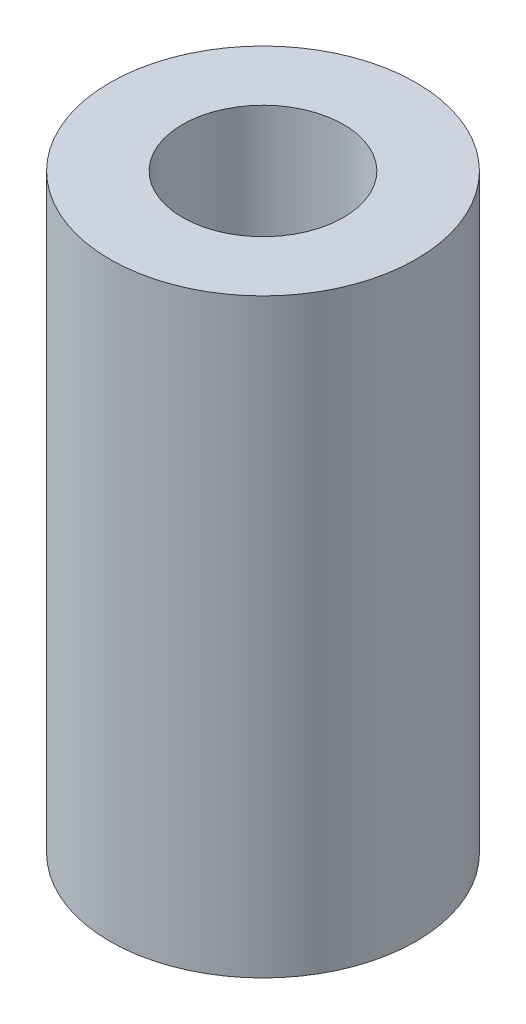
ISO-10303-21;
HEADER;
FILE_DESCRIPTION(('STEP AP214'),'2;1');
FILE_NAME('part.step','',(''),(''),'','','');
FILE_SCHEMA(('AUTOMOTIVE_DESIGN { 1 0 10303 214 1 1 1 1 }'));
ENDSEC;
DATA;
#1=APPLICATION_CONTEXT('core data for automotive mechanical design processes');
#2=APPLICATION_PROTOCOL_DEFINITION('international standard','automotive_design',2000,#1);
#3=PRODUCT_CONTEXT('',#1,'mechanical');
#4=PRODUCT('Part','Part','',(#3));
#5=PRODUCT_RELATED_PRODUCT_CATEGORY('part','',(#4));
#6=PRODUCT_DEFINITION_FORMATION('','',#4);
#7=PRODUCT_DEFINITION_CONTEXT('part definition',#1,'design');
#8=PRODUCT_DEFINITION('design','',#6,#7);
#9=PRODUCT_DEFINITION_SHAPE('','',#8);
#10=(LENGTH_UNIT() NAMED_UNIT(*) SI_UNIT(.MILLI.,.METRE.));
#11=(NAMED_UNIT(*) PLANE_ANGLE_UNIT() SI_UNIT($,.RADIAN.));
#12=(NAMED_UNIT(*) SI_UNIT($,.STERADIAN.) SOLID_ANGLE_UNIT());
#13=UNCERTAINTY_MEASURE_WITH_UNIT(LENGTH_MEASURE(1.E-05),#10,'distance_accuracy_value','');
#14=(GEOMETRIC_REPRESENTATION_CONTEXT(3) GLOBAL_UNCERTAINTY_ASSIGNED_CONTEXT((#13)) GLOBAL_UNIT_ASSIGNED_CONTEXT((#10,
#11,#12)) REPRESENTATION_CONTEXT('',''));
#15=CARTESIAN_POINT('',(0.,0.,0.));
#16=DIRECTION('',(0.,0.,1.));
#17=DIRECTION('',(1.,0.,0.));
#18=AXIS2_PLACEMENT_3D('',#15,#16,#17);
#19=CARTESIAN_POINT('',(0.,11.,0.));
#20=DIRECTION('',(0.,-1.,0.));
#21=DIRECTION('',(0.,0.,-1.));
#22=AXIS2_PLACEMENT_3D('',#19,#20,#21);
#23=CYLINDRICAL_SURFACE('',#22,1.25);
#24=CARTESIAN_POINT('',(0.,0.,0.));
#25=DIRECTION('',(0.,1.,0.));
#26=DIRECTION('',(0.,0.,1.));
#27=AXIS2_PLACEMENT_3D('',#24,#25,#26);
#28=CIRCLE('',#27,1.25);
#29=CARTESIAN_POINT('',(0.,0.,1.25));
#30=VERTEX_POINT('',#29);
#31=EDGE_CURVE('E45',#30,#30,#28,.T.);
#32=ORIENTED_EDGE('',*,*,#31,.F.);
#33=EDGE_LOOP('',(#32));
#34=FACE_BOUND('',#33,.T.);
#35=CARTESIAN_POINT('',(0.,6.,0.));
#36=DIRECTION('',(0.,1.,0.));
#37=DIRECTION('',(0.,0.,1.));
#38=AXIS2_PLACEMENT_3D('',#35,#36,#37);
#39=CIRCLE('',#38,1.25);
#40=CARTESIAN_POINT('',(0.,6.,1.25));
#41=VERTEX_POINT('',#40);
#42=EDGE_CURVE('E49',#41,#41,#39,.T.);
#43=ORIENTED_EDGE('',*,*,#42,.T.);
#44=EDGE_LOOP('',(#43));
#45=FACE_BOUND('',#44,.T.);
#46=ADVANCED_FACE('F32',(#34,#45),#23,.F.);
#47=CARTESIAN_POINT('',(0.,11.,0.));
#48=DIRECTION('',(0.,1.,0.));
#49=DIRECTION('',(0.,0.,1.));
#50=AXIS2_PLACEMENT_3D('',#47,#48,#49);
#51=PLANE('',#50);
#52=CARTESIAN_POINT('',(0.,11.,0.));
#53=DIRECTION('',(0.,1.,0.));
#54=DIRECTION('',(0.,0.,1.));
#55=AXIS2_PLACEMENT_3D('',#52,#53,#54);
#56=CIRCLE('',#55,1.5);
#57=CARTESIAN_POINT('',(0.,11.,1.5));
#58=VERTEX_POINT('',#57);
#59=EDGE_CURVE('E36',#58,#58,#56,.F.);
#60=ORIENTED_EDGE('',*,*,#59,.T.);
#61=EDGE_LOOP('',(#60));
#62=FACE_BOUND('',#61,.T.);
#63=CARTESIAN_POINT('',(0.,11.,0.));
#64=DIRECTION('',(0.,1.,0.));
#65=DIRECTION('',(0.,0.,1.));
#66=AXIS2_PLACEMENT_3D('',#63,#64,#65);
#67=CIRCLE('',#66,2.85);
#68=CARTESIAN_POINT('',(0.,11.,2.85));
#69=VERTEX_POINT('',#68);
#70=EDGE_CURVE('E10',#69,#69,#67,.T.);
#71=ORIENTED_EDGE('',*,*,#70,.T.);
#72=EDGE_LOOP('',(#71));
#73=FACE_BOUND('',#72,.T.);
#74=ADVANCED_FACE('F75',(#62,#73),#51,.T.);
#75=CARTESIAN_POINT('',(0.,0.,0.));
#76=DIRECTION('',(0.,1.,0.));
#77=DIRECTION('',(0.,0.,1.));
#78=AXIS2_PLACEMENT_3D('',#75,#76,#77);
#79=PLANE('',#78);
#80=CARTESIAN_POINT('',(0.,0.,0.));
#81=DIRECTION('',(0.,1.,0.));
#82=DIRECTION('',(0.,0.,1.));
#83=AXIS2_PLACEMENT_3D('',#80,#81,#82);
#84=CIRCLE('',#83,2.85);
#85=CARTESIAN_POINT('',(0.,0.,2.85));
#86=VERTEX_POINT('',#85);
#87=EDGE_CURVE('E40',#86,#86,#84,.T.);
#88=ORIENTED_EDGE('',*,*,#87,.F.);
#89=EDGE_LOOP('',(#88));
#90=FACE_BOUND('',#89,.T.);
#91=ORIENTED_EDGE('',*,*,#31,.T.);
#92=EDGE_LOOP('',(#91));
#93=FACE_BOUND('',#92,.T.);
#94=ADVANCED_FACE('F70',(#90,#93),#79,.F.);
#95=CARTESIAN_POINT('',(0.,11.,0.));
#96=DIRECTION('',(0.,-1.,0.));
#97=DIRECTION('',(0.,0.,-1.));
#98=AXIS2_PLACEMENT_3D('',#95,#96,#97);
#99=CYLINDRICAL_SURFACE('',#98,2.85);
#100=ORIENTED_EDGE('',*,*,#70,.F.);
#101=EDGE_LOOP('',(#100));
#102=FACE_BOUND('',#101,.T.);
#103=ORIENTED_EDGE('',*,*,#87,.T.);
#104=EDGE_LOOP('',(#103));
#105=FACE_BOUND('',#104,.T.);
#106=ADVANCED_FACE('F34',(#102,#105),#99,.T.);
#107=CARTESIAN_POINT('',(0.,12.,0.));
#108=DIRECTION('',(0.,-1.,0.));
#109=DIRECTION('',(0.,0.,-1.));
#110=AXIS2_PLACEMENT_3D('',#107,#108,#109);
#111=CYLINDRICAL_SURFACE('',#110,1.5);
#112=ORIENTED_EDGE('',*,*,#59,.F.);
#113=EDGE_LOOP('',(#112));
#114=FACE_BOUND('',#113,.T.);
#115=CARTESIAN_POINT('',(0.,6.,0.));
#116=DIRECTION('',(0.,1.,0.));
#117=DIRECTION('',(0.,0.,1.));
#118=AXIS2_PLACEMENT_3D('',#115,#116,#117);
#119=CIRCLE('',#118,1.5);
#120=CARTESIAN_POINT('',(0.,6.,1.5));
#121=VERTEX_POINT('',#120);
#122=EDGE_CURVE('E51',#121,#121,#119,.T.);
#123=ORIENTED_EDGE('',*,*,#122,.F.);
#124=EDGE_LOOP('',(#123));
#125=FACE_BOUND('',#124,.T.);
#126=ADVANCED_FACE('F60',(#114,#125),#111,.F.);
#127=CARTESIAN_POINT('',(0.,6.,0.));
#128=DIRECTION('',(0.,1.,0.));
#129=DIRECTION('',(0.,0.,1.));
#130=AXIS2_PLACEMENT_3D('',#127,#128,#129);
#131=PLANE('',#130);
#132=ORIENTED_EDGE('',*,*,#42,.F.);
#133=EDGE_LOOP('',(#132));
#134=FACE_BOUND('',#133,.T.);
#135=ORIENTED_EDGE('',*,*,#122,.T.);
#136=EDGE_LOOP('',(#135));
#137=FACE_BOUND('',#136,.T.);
#138=ADVANCED_FACE('F58',(#134,#137),#131,.T.);
#139=CLOSED_SHELL('',(#46,#74,#94,#106,#126,#138));
#140=MANIFOLD_SOLID_BREP('B2',#139);
#141=ADVANCED_BREP_SHAPE_REPRESENTATION('',(#18,#140),#14);
#142=SHAPE_DEFINITION_REPRESENTATION(#9,#141);
ENDSEC;
END-ISO-10303-21;
